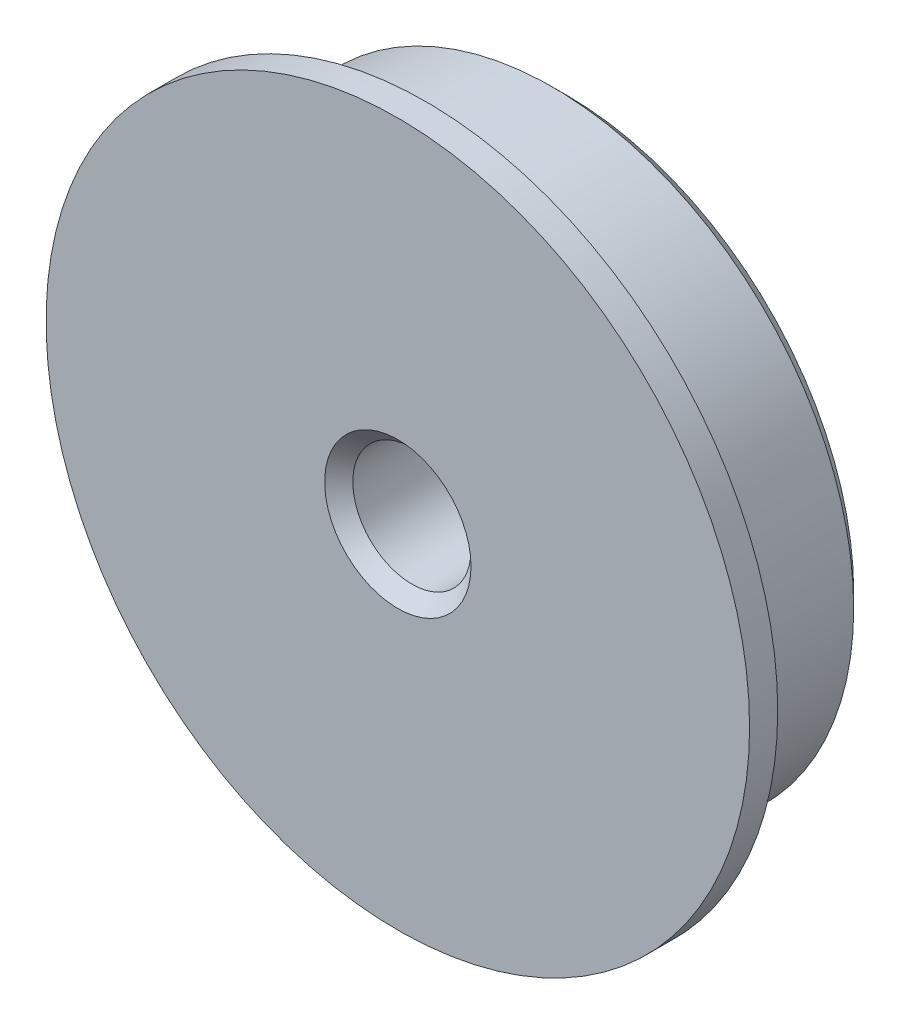
ISO-10303-21;
HEADER;
FILE_DESCRIPTION(('STEP AP214'),'2;1');
FILE_NAME('part.step','',(''),(''),'','','');
FILE_SCHEMA(('AUTOMOTIVE_DESIGN { 1 0 10303 214 1 1 1 1 }'));
ENDSEC;
DATA;
#1=APPLICATION_CONTEXT('core data for automotive mechanical design processes');
#2=APPLICATION_PROTOCOL_DEFINITION('international standard','automotive_design',2000,#1);
#3=PRODUCT_CONTEXT('',#1,'mechanical');
#4=PRODUCT('Part','Part','',(#3));
#5=PRODUCT_RELATED_PRODUCT_CATEGORY('part','',(#4));
#6=PRODUCT_DEFINITION_FORMATION('','',#4);
#7=PRODUCT_DEFINITION_CONTEXT('part definition',#1,'design');
#8=PRODUCT_DEFINITION('design','',#6,#7);
#9=PRODUCT_DEFINITION_SHAPE('','',#8);
#10=(LENGTH_UNIT() NAMED_UNIT(*) SI_UNIT(.MILLI.,.METRE.));
#11=(NAMED_UNIT(*) PLANE_ANGLE_UNIT() SI_UNIT($,.RADIAN.));
#12=(NAMED_UNIT(*) SI_UNIT($,.STERADIAN.) SOLID_ANGLE_UNIT());
#13=UNCERTAINTY_MEASURE_WITH_UNIT(LENGTH_MEASURE(1.E-05),#10,'distance_accuracy_value','');
#14=(GEOMETRIC_REPRESENTATION_CONTEXT(3) GLOBAL_UNCERTAINTY_ASSIGNED_CONTEXT((#13)) GLOBAL_UNIT_ASSIGNED_CONTEXT((#10,
#11,#12)) REPRESENTATION_CONTEXT('',''));
#15=CARTESIAN_POINT('',(0.,0.,0.));
#16=DIRECTION('',(0.,0.,1.));
#17=DIRECTION('',(1.,0.,0.));
#18=AXIS2_PLACEMENT_3D('',#15,#16,#17);
#19=CARTESIAN_POINT('',(0.,0.,10.));
#20=DIRECTION('',(0.,0.,-1.));
#21=DIRECTION('',(-1.,0.,0.));
#22=AXIS2_PLACEMENT_3D('',#19,#20,#21);
#23=CYLINDRICAL_SURFACE('',#22,21.4);
#24=CARTESIAN_POINT('',(0.,0.,0.999999999999997));
#25=DIRECTION('',(0.,0.,1.));
#26=DIRECTION('',(1.,0.,0.));
#27=AXIS2_PLACEMENT_3D('',#24,#25,#26);
#28=CIRCLE('',#27,21.4);
#29=CARTESIAN_POINT('',(21.4,0.,0.999999999999997));
#30=VERTEX_POINT('',#29);
#31=EDGE_CURVE('E68',#30,#30,#28,.T.);
#32=ORIENTED_EDGE('',*,*,#31,.T.);
#33=EDGE_LOOP('',(#32));
#34=FACE_BOUND('',#33,.T.);
#35=CARTESIAN_POINT('',(0.,0.,10.));
#36=DIRECTION('',(0.,0.,1.));
#37=DIRECTION('',(1.,0.,0.));
#38=AXIS2_PLACEMENT_3D('',#35,#36,#37);
#39=CIRCLE('',#38,21.4);
#40=CARTESIAN_POINT('',(21.4,0.,10.));
#41=VERTEX_POINT('',#40);
#42=EDGE_CURVE('E72',#41,#41,#39,.T.);
#43=ORIENTED_EDGE('',*,*,#42,.F.);
#44=EDGE_LOOP('',(#43));
#45=FACE_BOUND('',#44,.T.);
#46=ADVANCED_FACE('F39',(#34,#45),#23,.T.);
#47=CARTESIAN_POINT('',(0.,0.,0.));
#48=DIRECTION('',(0.,0.,1.));
#49=DIRECTION('',(1.,0.,0.));
#50=AXIS2_PLACEMENT_3D('',#47,#48,#49);
#51=PLANE('',#50);
#52=CARTESIAN_POINT('',(0.,0.,0.));
#53=DIRECTION('',(0.,0.,1.));
#54=DIRECTION('',(1.,0.,0.));
#55=AXIS2_PLACEMENT_3D('',#52,#53,#54);
#56=CIRCLE('',#55,20.4);
#57=CARTESIAN_POINT('',(20.4,0.,0.));
#58=VERTEX_POINT('',#57);
#59=EDGE_CURVE('E58',#58,#58,#56,.F.);
#60=ORIENTED_EDGE('',*,*,#59,.T.);
#61=EDGE_LOOP('',(#60));
#62=FACE_BOUND('',#61,.T.);
#63=CARTESIAN_POINT('',(0.,0.,0.));
#64=DIRECTION('',(0.,0.,1.));
#65=DIRECTION('',(1.,0.,0.));
#66=AXIS2_PLACEMENT_3D('',#63,#64,#65);
#67=CIRCLE('',#66,5.2);
#68=CARTESIAN_POINT('',(5.2,0.,0.));
#69=VERTEX_POINT('',#68);
#70=EDGE_CURVE('E64',#69,#69,#67,.T.);
#71=ORIENTED_EDGE('',*,*,#70,.T.);
#72=EDGE_LOOP('',(#71));
#73=FACE_BOUND('',#72,.T.);
#74=ADVANCED_FACE('F90',(#62,#73),#51,.F.);
#75=CARTESIAN_POINT('',(0.,0.,12.));
#76=DIRECTION('',(0.,0.,-1.));
#77=DIRECTION('',(-1.,0.,0.));
#78=AXIS2_PLACEMENT_3D('',#75,#76,#77);
#79=CYLINDRICAL_SURFACE('',#78,25.);
#80=CARTESIAN_POINT('',(0.,0.,12.));
#81=DIRECTION('',(0.,0.,1.));
#82=DIRECTION('',(1.,0.,0.));
#83=AXIS2_PLACEMENT_3D('',#80,#81,#82);
#84=CIRCLE('',#83,25.);
#85=CARTESIAN_POINT('',(25.,0.,12.));
#86=VERTEX_POINT('',#85);
#87=EDGE_CURVE('E76',#86,#86,#84,.T.);
#88=ORIENTED_EDGE('',*,*,#87,.F.);
#89=EDGE_LOOP('',(#88));
#90=FACE_BOUND('',#89,.T.);
#91=CARTESIAN_POINT('',(0.,0.,10.));
#92=DIRECTION('',(0.,0.,1.));
#93=DIRECTION('',(1.,0.,0.));
#94=AXIS2_PLACEMENT_3D('',#91,#92,#93);
#95=CIRCLE('',#94,25.);
#96=CARTESIAN_POINT('',(25.,0.,10.));
#97=VERTEX_POINT('',#96);
#98=EDGE_CURVE('E77',#97,#97,#95,.T.);
#99=ORIENTED_EDGE('',*,*,#98,.T.);
#100=EDGE_LOOP('',(#99));
#101=FACE_BOUND('',#100,.T.);
#102=ADVANCED_FACE('F87',(#90,#101),#79,.T.);
#103=CARTESIAN_POINT('',(0.,0.,12.));
#104=DIRECTION('',(0.,0.,1.));
#105=DIRECTION('',(1.,0.,0.));
#106=AXIS2_PLACEMENT_3D('',#103,#104,#105);
#107=PLANE('',#106);
#108=CARTESIAN_POINT('',(0.,0.,12.));
#109=DIRECTION('',(0.,0.,1.));
#110=DIRECTION('',(1.,0.,0.));
#111=AXIS2_PLACEMENT_3D('',#108,#109,#110);
#112=CIRCLE('',#111,5.20000000000002);
#113=CARTESIAN_POINT('',(5.20000000000002,0.,12.));
#114=VERTEX_POINT('',#113);
#115=EDGE_CURVE('E10',#114,#114,#112,.F.);
#116=ORIENTED_EDGE('',*,*,#115,.T.);
#117=EDGE_LOOP('',(#116));
#118=FACE_BOUND('',#117,.T.);
#119=ORIENTED_EDGE('',*,*,#87,.T.);
#120=EDGE_LOOP('',(#119));
#121=FACE_BOUND('',#120,.T.);
#122=ADVANCED_FACE('F85',(#118,#121),#107,.T.);
#123=CARTESIAN_POINT('',(0.,0.,10.));
#124=DIRECTION('',(0.,0.,1.));
#125=DIRECTION('',(1.,0.,0.));
#126=AXIS2_PLACEMENT_3D('',#123,#124,#125);
#127=PLANE('',#126);
#128=ORIENTED_EDGE('',*,*,#42,.T.);
#129=EDGE_LOOP('',(#128));
#130=FACE_BOUND('',#129,.T.);
#131=ORIENTED_EDGE('',*,*,#98,.F.);
#132=EDGE_LOOP('',(#131));
#133=FACE_BOUND('',#132,.T.);
#134=ADVANCED_FACE('F94',(#130,#133),#127,.F.);
#135=CARTESIAN_POINT('',(0.,0.,0.));
#136=DIRECTION('',(0.,0.,1.));
#137=DIRECTION('',(1.,0.,0.));
#138=AXIS2_PLACEMENT_3D('',#135,#136,#137);
#139=CYLINDRICAL_SURFACE('',#138,4.2);
#140=CARTESIAN_POINT('',(0.,0.,1.));
#141=DIRECTION('',(0.,0.,1.));
#142=DIRECTION('',(1.,0.,0.));
#143=AXIS2_PLACEMENT_3D('',#140,#141,#142);
#144=CIRCLE('',#143,4.2);
#145=CARTESIAN_POINT('',(4.2,0.,1.));
#146=VERTEX_POINT('',#145);
#147=EDGE_CURVE('E48',#146,#146,#144,.F.);
#148=ORIENTED_EDGE('',*,*,#147,.T.);
#149=EDGE_LOOP('',(#148));
#150=FACE_BOUND('',#149,.T.);
#151=CARTESIAN_POINT('',(0.,0.,11.));
#152=DIRECTION('',(0.,0.,1.));
#153=DIRECTION('',(1.,0.,0.));
#154=AXIS2_PLACEMENT_3D('',#151,#152,#153);
#155=CIRCLE('',#154,4.2);
#156=CARTESIAN_POINT('',(4.2,0.,11.));
#157=VERTEX_POINT('',#156);
#158=EDGE_CURVE('E53',#157,#157,#155,.T.);
#159=ORIENTED_EDGE('',*,*,#158,.T.);
#160=EDGE_LOOP('',(#159));
#161=FACE_BOUND('',#160,.T.);
#162=ADVANCED_FACE('F96',(#150,#161),#139,.F.);
#163=CARTESIAN_POINT('',(0.,0.,0.999999999999997));
#164=DIRECTION('',(0.,0.,1.));
#165=DIRECTION('',(1.,0.,0.));
#166=AXIS2_PLACEMENT_3D('',#163,#164,#165);
#167=CONICAL_SURFACE('',#166,21.4,0.785398163397452);
#168=ORIENTED_EDGE('',*,*,#59,.F.);
#169=EDGE_LOOP('',(#168));
#170=FACE_BOUND('',#169,.T.);
#171=ORIENTED_EDGE('',*,*,#31,.F.);
#172=EDGE_LOOP('',(#171));
#173=FACE_BOUND('',#172,.T.);
#174=ADVANCED_FACE('F103',(#170,#173),#167,.T.);
#175=CARTESIAN_POINT('',(0.,0.,0.));
#176=DIRECTION('',(0.,0.,-1.));
#177=DIRECTION('',(-1.,0.,0.));
#178=AXIS2_PLACEMENT_3D('',#175,#176,#177);
#179=CONICAL_SURFACE('',#178,5.2,0.785398163397445);
#180=ORIENTED_EDGE('',*,*,#147,.F.);
#181=EDGE_LOOP('',(#180));
#182=FACE_BOUND('',#181,.T.);
#183=ORIENTED_EDGE('',*,*,#70,.F.);
#184=EDGE_LOOP('',(#183));
#185=FACE_BOUND('',#184,.T.);
#186=ADVANCED_FACE('F121',(#182,#185),#179,.F.);
#187=CARTESIAN_POINT('',(0.,0.,11.));
#188=DIRECTION('',(0.,0.,1.));
#189=DIRECTION('',(1.,0.,0.));
#190=AXIS2_PLACEMENT_3D('',#187,#188,#189);
#191=CONICAL_SURFACE('',#190,4.2,0.785398163397451);
#192=ORIENTED_EDGE('',*,*,#115,.F.);
#193=EDGE_LOOP('',(#192));
#194=FACE_BOUND('',#193,.T.);
#195=ORIENTED_EDGE('',*,*,#158,.F.);
#196=EDGE_LOOP('',(#195));
#197=FACE_BOUND('',#196,.T.);
#198=ADVANCED_FACE('F42',(#194,#197),#191,.F.);
#199=CLOSED_SHELL('',(#46,#74,#102,#122,#134,#162,#174,#186,#198));
#200=MANIFOLD_SOLID_BREP('B2',#199);
#201=ADVANCED_BREP_SHAPE_REPRESENTATION('',(#18,#200),#14);
#202=SHAPE_DEFINITION_REPRESENTATION(#9,#201);
ENDSEC;
END-ISO-10303-21;
